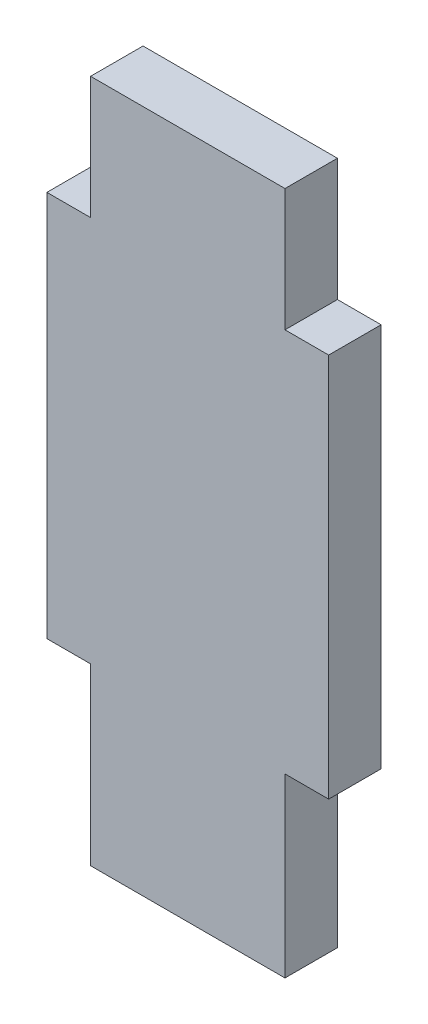
ISO-10303-21;
HEADER;
FILE_DESCRIPTION(('STEP AP214'),'2;1');
FILE_NAME('part.step','',(''),(''),'','','');
FILE_SCHEMA(('AUTOMOTIVE_DESIGN { 1 0 10303 214 1 1 1 1 }'));
ENDSEC;
DATA;
#1=APPLICATION_CONTEXT('core data for automotive mechanical design processes');
#2=APPLICATION_PROTOCOL_DEFINITION('international standard','automotive_design',2000,#1);
#3=PRODUCT_CONTEXT('',#1,'mechanical');
#4=PRODUCT('Part','Part','',(#3));
#5=PRODUCT_RELATED_PRODUCT_CATEGORY('part','',(#4));
#6=PRODUCT_DEFINITION_FORMATION('','',#4);
#7=PRODUCT_DEFINITION_CONTEXT('part definition',#1,'design');
#8=PRODUCT_DEFINITION('design','',#6,#7);
#9=PRODUCT_DEFINITION_SHAPE('','',#8);
#10=(LENGTH_UNIT() NAMED_UNIT(*) SI_UNIT(.MILLI.,.METRE.));
#11=(NAMED_UNIT(*) PLANE_ANGLE_UNIT() SI_UNIT($,.RADIAN.));
#12=(NAMED_UNIT(*) SI_UNIT($,.STERADIAN.) SOLID_ANGLE_UNIT());
#13=UNCERTAINTY_MEASURE_WITH_UNIT(LENGTH_MEASURE(1.E-05),#10,'distance_accuracy_value','');
#14=(GEOMETRIC_REPRESENTATION_CONTEXT(3) GLOBAL_UNCERTAINTY_ASSIGNED_CONTEXT((#13)) GLOBAL_UNIT_ASSIGNED_CONTEXT((#10,
#11,#12)) REPRESENTATION_CONTEXT('',''));
#15=CARTESIAN_POINT('',(0.,0.,0.));
#16=DIRECTION('',(0.,0.,1.));
#17=DIRECTION('',(1.,0.,0.));
#18=AXIS2_PLACEMENT_3D('',#15,#16,#17);
#19=CARTESIAN_POINT('',(701.892545338705,-103.808025338847,3.));
#20=DIRECTION('',(1.,0.,0.));
#21=DIRECTION('',(0.,0.,-1.));
#22=AXIS2_PLACEMENT_3D('',#19,#20,#21);
#23=PLANE('',#22);
#24=DIRECTION('',(0.,-1.,0.));
#25=VECTOR('',#24,1.);
#26=CARTESIAN_POINT('',(701.892545338705,-103.808025338847,0.));
#27=LINE('',#26,#25);
#28=CARTESIAN_POINT('',(701.892545338705,-81.6978872067932,0.));
#29=VERTEX_POINT('',#28);
#30=CARTESIAN_POINT('',(701.892545338705,-103.808025338847,0.));
#31=VERTEX_POINT('',#30);
#32=EDGE_CURVE('E124',#29,#31,#27,.T.);
#33=ORIENTED_EDGE('',*,*,#32,.T.);
#34=DIRECTION('',(0.,0.,-1.));
#35=VECTOR('',#34,1.);
#36=CARTESIAN_POINT('',(701.892545338705,-103.808025338847,3.));
#37=LINE('',#36,#35);
#38=CARTESIAN_POINT('',(701.892545338705,-103.808025338847,3.));
#39=VERTEX_POINT('',#38);
#40=EDGE_CURVE('E11',#39,#31,#37,.T.);
#41=ORIENTED_EDGE('',*,*,#40,.F.);
#42=DIRECTION('',(0.,-1.,0.));
#43=VECTOR('',#42,1.);
#44=CARTESIAN_POINT('',(701.892545338705,-103.808025338847,3.));
#45=LINE('',#44,#43);
#46=CARTESIAN_POINT('',(701.892545338705,-81.6978872067932,3.));
#47=VERTEX_POINT('',#46);
#48=EDGE_CURVE('E159',#47,#39,#45,.T.);
#49=ORIENTED_EDGE('',*,*,#48,.F.);
#50=DIRECTION('',(0.,0.,-1.));
#51=VECTOR('',#50,1.);
#52=CARTESIAN_POINT('',(701.892545338705,-81.6978872067932,3.));
#53=LINE('',#52,#51);
#54=EDGE_CURVE('E137',#47,#29,#53,.T.);
#55=ORIENTED_EDGE('',*,*,#54,.T.);
#56=EDGE_LOOP('',(#33,#41,#49,#55));
#57=FACE_BOUND('',#56,.T.);
#58=ADVANCED_FACE('F32',(#57),#23,.F.);
#59=CARTESIAN_POINT('',(704.392545338705,-103.808025338847,3.));
#60=DIRECTION('',(0.,1.,0.));
#61=DIRECTION('',(0.,0.,1.));
#62=AXIS2_PLACEMENT_3D('',#59,#60,#61);
#63=PLANE('',#62);
#64=DIRECTION('',(1.,0.,0.));
#65=VECTOR('',#64,1.);
#66=CARTESIAN_POINT('',(704.392545338705,-103.808025338847,0.));
#67=LINE('',#66,#65);
#68=CARTESIAN_POINT('',(704.392545338705,-103.808025338847,0.));
#69=VERTEX_POINT('',#68);
#70=EDGE_CURVE('E120',#31,#69,#67,.T.);
#71=ORIENTED_EDGE('',*,*,#70,.T.);
#72=DIRECTION('',(0.,0.,-1.));
#73=VECTOR('',#72,1.);
#74=CARTESIAN_POINT('',(704.392545338705,-103.808025338847,3.));
#75=LINE('',#74,#73);
#76=CARTESIAN_POINT('',(704.392545338705,-103.808025338847,3.));
#77=VERTEX_POINT('',#76);
#78=EDGE_CURVE('E39',#77,#69,#75,.T.);
#79=ORIENTED_EDGE('',*,*,#78,.F.);
#80=DIRECTION('',(1.,0.,0.));
#81=VECTOR('',#80,1.);
#82=CARTESIAN_POINT('',(704.392545338705,-103.808025338847,3.));
#83=LINE('',#82,#81);
#84=EDGE_CURVE('E133',#39,#77,#83,.T.);
#85=ORIENTED_EDGE('',*,*,#84,.F.);
#86=ORIENTED_EDGE('',*,*,#40,.T.);
#87=EDGE_LOOP('',(#71,#79,#85,#86));
#88=FACE_BOUND('',#87,.T.);
#89=ADVANCED_FACE('F132',(#88),#63,.F.);
#90=CARTESIAN_POINT('',(704.392545338705,-113.808025338847,3.));
#91=DIRECTION('',(1.,0.,0.));
#92=DIRECTION('',(0.,0.,-1.));
#93=AXIS2_PLACEMENT_3D('',#90,#91,#92);
#94=PLANE('',#93);
#95=DIRECTION('',(0.,-1.,0.));
#96=VECTOR('',#95,1.);
#97=CARTESIAN_POINT('',(704.392545338705,-113.808025338847,0.));
#98=LINE('',#97,#96);
#99=CARTESIAN_POINT('',(704.392545338705,-113.808025338847,0.));
#100=VERTEX_POINT('',#99);
#101=EDGE_CURVE('E126',#69,#100,#98,.T.);
#102=ORIENTED_EDGE('',*,*,#101,.T.);
#103=DIRECTION('',(0.,0.,-1.));
#104=VECTOR('',#103,1.);
#105=CARTESIAN_POINT('',(704.392545338705,-113.808025338847,3.));
#106=LINE('',#105,#104);
#107=CARTESIAN_POINT('',(704.392545338705,-113.808025338847,3.));
#108=VERTEX_POINT('',#107);
#109=EDGE_CURVE('E205',#108,#100,#106,.T.);
#110=ORIENTED_EDGE('',*,*,#109,.F.);
#111=DIRECTION('',(0.,-1.,0.));
#112=VECTOR('',#111,1.);
#113=CARTESIAN_POINT('',(704.392545338705,-113.808025338847,3.));
#114=LINE('',#113,#112);
#115=EDGE_CURVE('E162',#77,#108,#114,.T.);
#116=ORIENTED_EDGE('',*,*,#115,.F.);
#117=ORIENTED_EDGE('',*,*,#78,.T.);
#118=EDGE_LOOP('',(#102,#110,#116,#117));
#119=FACE_BOUND('',#118,.T.);
#120=ADVANCED_FACE('F209',(#119),#94,.F.);
#121=CARTESIAN_POINT('',(715.512545338705,-113.808025338847,3.));
#122=DIRECTION('',(0.,1.,0.));
#123=DIRECTION('',(0.,0.,1.));
#124=AXIS2_PLACEMENT_3D('',#121,#122,#123);
#125=PLANE('',#124);
#126=DIRECTION('',(1.,0.,0.));
#127=VECTOR('',#126,1.);
#128=CARTESIAN_POINT('',(715.512545338705,-113.808025338847,0.));
#129=LINE('',#128,#127);
#130=CARTESIAN_POINT('',(715.512545338705,-113.808025338847,0.));
#131=VERTEX_POINT('',#130);
#132=EDGE_CURVE('E141',#100,#131,#129,.T.);
#133=ORIENTED_EDGE('',*,*,#132,.T.);
#134=DIRECTION('',(0.,0.,-1.));
#135=VECTOR('',#134,1.);
#136=CARTESIAN_POINT('',(715.512545338705,-113.808025338847,3.));
#137=LINE('',#136,#135);
#138=CARTESIAN_POINT('',(715.512545338705,-113.808025338847,3.));
#139=VERTEX_POINT('',#138);
#140=EDGE_CURVE('E202',#139,#131,#137,.T.);
#141=ORIENTED_EDGE('',*,*,#140,.F.);
#142=DIRECTION('',(1.,0.,0.));
#143=VECTOR('',#142,1.);
#144=CARTESIAN_POINT('',(715.512545338705,-113.808025338847,3.));
#145=LINE('',#144,#143);
#146=EDGE_CURVE('E164',#108,#139,#145,.T.);
#147=ORIENTED_EDGE('',*,*,#146,.F.);
#148=ORIENTED_EDGE('',*,*,#109,.T.);
#149=EDGE_LOOP('',(#133,#141,#147,#148));
#150=FACE_BOUND('',#149,.T.);
#151=ADVANCED_FACE('F217',(#150),#125,.F.);
#152=CARTESIAN_POINT('',(715.512545338705,-113.808025338847,3.));
#153=DIRECTION('',(-1.,0.,0.));
#154=DIRECTION('',(0.,0.,1.));
#155=AXIS2_PLACEMENT_3D('',#152,#153,#154);
#156=PLANE('',#155);
#157=DIRECTION('',(0.,1.,0.));
#158=VECTOR('',#157,1.);
#159=CARTESIAN_POINT('',(715.512545338705,-113.808025338847,0.));
#160=LINE('',#159,#158);
#161=CARTESIAN_POINT('',(715.512545338705,-103.697887206793,0.));
#162=VERTEX_POINT('',#161);
#163=EDGE_CURVE('E143',#131,#162,#160,.T.);
#164=ORIENTED_EDGE('',*,*,#163,.T.);
#165=DIRECTION('',(0.,0.,-1.));
#166=VECTOR('',#165,1.);
#167=CARTESIAN_POINT('',(715.512545338705,-103.697887206793,3.));
#168=LINE('',#167,#166);
#169=CARTESIAN_POINT('',(715.512545338705,-103.697887206793,3.));
#170=VERTEX_POINT('',#169);
#171=EDGE_CURVE('E199',#170,#162,#168,.T.);
#172=ORIENTED_EDGE('',*,*,#171,.F.);
#173=DIRECTION('',(0.,1.,0.));
#174=VECTOR('',#173,1.);
#175=CARTESIAN_POINT('',(715.512545338705,-113.808025338847,3.));
#176=LINE('',#175,#174);
#177=EDGE_CURVE('E166',#139,#170,#176,.T.);
#178=ORIENTED_EDGE('',*,*,#177,.F.);
#179=ORIENTED_EDGE('',*,*,#140,.T.);
#180=EDGE_LOOP('',(#164,#172,#178,#179));
#181=FACE_BOUND('',#180,.T.);
#182=ADVANCED_FACE('F220',(#181),#156,.F.);
#183=CARTESIAN_POINT('',(715.512545338705,-103.697887206793,3.));
#184=DIRECTION('',(0.,1.,0.));
#185=DIRECTION('',(0.,0.,1.));
#186=AXIS2_PLACEMENT_3D('',#183,#184,#185);
#187=PLANE('',#186);
#188=DIRECTION('',(1.,0.,0.));
#189=VECTOR('',#188,1.);
#190=CARTESIAN_POINT('',(715.512545338705,-103.697887206793,0.));
#191=LINE('',#190,#189);
#192=CARTESIAN_POINT('',(718.011485221152,-103.697887206793,0.));
#193=VERTEX_POINT('',#192);
#194=EDGE_CURVE('E145',#162,#193,#191,.T.);
#195=ORIENTED_EDGE('',*,*,#194,.T.);
#196=DIRECTION('',(0.,0.,-1.));
#197=VECTOR('',#196,1.);
#198=CARTESIAN_POINT('',(718.011485221152,-103.697887206793,3.));
#199=LINE('',#198,#197);
#200=CARTESIAN_POINT('',(718.011485221152,-103.697887206793,3.));
#201=VERTEX_POINT('',#200);
#202=EDGE_CURVE('E196',#201,#193,#199,.T.);
#203=ORIENTED_EDGE('',*,*,#202,.F.);
#204=DIRECTION('',(1.,0.,0.));
#205=VECTOR('',#204,1.);
#206=CARTESIAN_POINT('',(715.512545338705,-103.697887206793,3.));
#207=LINE('',#206,#205);
#208=EDGE_CURVE('E168',#170,#201,#207,.T.);
#209=ORIENTED_EDGE('',*,*,#208,.F.);
#210=ORIENTED_EDGE('',*,*,#171,.T.);
#211=EDGE_LOOP('',(#195,#203,#209,#210));
#212=FACE_BOUND('',#211,.T.);
#213=ADVANCED_FACE('F225',(#212),#187,.F.);
#214=CARTESIAN_POINT('',(718.011485221152,-81.6978872067932,3.));
#215=DIRECTION('',(-1.,0.,0.));
#216=DIRECTION('',(0.,0.,1.));
#217=AXIS2_PLACEMENT_3D('',#214,#215,#216);
#218=PLANE('',#217);
#219=DIRECTION('',(0.,1.,0.));
#220=VECTOR('',#219,1.);
#221=CARTESIAN_POINT('',(718.011485221152,-81.6978872067932,0.));
#222=LINE('',#221,#220);
#223=CARTESIAN_POINT('',(718.011485221152,-81.6978872067932,0.));
#224=VERTEX_POINT('',#223);
#225=EDGE_CURVE('E147',#193,#224,#222,.T.);
#226=ORIENTED_EDGE('',*,*,#225,.T.);
#227=DIRECTION('',(0.,0.,-1.));
#228=VECTOR('',#227,1.);
#229=CARTESIAN_POINT('',(718.011485221152,-81.6978872067932,3.));
#230=LINE('',#229,#228);
#231=CARTESIAN_POINT('',(718.011485221152,-81.6978872067932,3.));
#232=VERTEX_POINT('',#231);
#233=EDGE_CURVE('E193',#232,#224,#230,.T.);
#234=ORIENTED_EDGE('',*,*,#233,.F.);
#235=DIRECTION('',(0.,1.,0.));
#236=VECTOR('',#235,1.);
#237=CARTESIAN_POINT('',(718.011485221152,-81.6978872067932,3.));
#238=LINE('',#237,#236);
#239=EDGE_CURVE('E170',#201,#232,#238,.T.);
#240=ORIENTED_EDGE('',*,*,#239,.F.);
#241=ORIENTED_EDGE('',*,*,#202,.T.);
#242=EDGE_LOOP('',(#226,#234,#240,#241));
#243=FACE_BOUND('',#242,.T.);
#244=ADVANCED_FACE('F231',(#243),#218,.F.);
#245=CARTESIAN_POINT('',(715.512545338705,-81.6978872067932,3.));
#246=DIRECTION('',(0.,-1.,0.));
#247=DIRECTION('',(0.,0.,-1.));
#248=AXIS2_PLACEMENT_3D('',#245,#246,#247);
#249=PLANE('',#248);
#250=DIRECTION('',(-1.,0.,0.));
#251=VECTOR('',#250,1.);
#252=CARTESIAN_POINT('',(715.512545338705,-81.6978872067932,0.));
#253=LINE('',#252,#251);
#254=CARTESIAN_POINT('',(715.512545338705,-81.6978872067932,0.));
#255=VERTEX_POINT('',#254);
#256=EDGE_CURVE('E149',#224,#255,#253,.T.);
#257=ORIENTED_EDGE('',*,*,#256,.T.);
#258=DIRECTION('',(0.,0.,-1.));
#259=VECTOR('',#258,1.);
#260=CARTESIAN_POINT('',(715.512545338705,-81.6978872067932,3.));
#261=LINE('',#260,#259);
#262=CARTESIAN_POINT('',(715.512545338705,-81.6978872067932,3.));
#263=VERTEX_POINT('',#262);
#264=EDGE_CURVE('E190',#263,#255,#261,.T.);
#265=ORIENTED_EDGE('',*,*,#264,.F.);
#266=DIRECTION('',(-1.,0.,0.));
#267=VECTOR('',#266,1.);
#268=CARTESIAN_POINT('',(715.512545338705,-81.6978872067932,3.));
#269=LINE('',#268,#267);
#270=EDGE_CURVE('E172',#232,#263,#269,.T.);
#271=ORIENTED_EDGE('',*,*,#270,.F.);
#272=ORIENTED_EDGE('',*,*,#233,.T.);
#273=EDGE_LOOP('',(#257,#265,#271,#272));
#274=FACE_BOUND('',#273,.T.);
#275=ADVANCED_FACE('F235',(#274),#249,.F.);
#276=CARTESIAN_POINT('',(715.512545338705,-74.6978872067932,3.));
#277=DIRECTION('',(-1.,0.,0.));
#278=DIRECTION('',(0.,0.,1.));
#279=AXIS2_PLACEMENT_3D('',#276,#277,#278);
#280=PLANE('',#279);
#281=DIRECTION('',(0.,1.,0.));
#282=VECTOR('',#281,1.);
#283=CARTESIAN_POINT('',(715.512545338705,-74.6978872067932,0.));
#284=LINE('',#283,#282);
#285=CARTESIAN_POINT('',(715.512545338705,-74.6978872067932,0.));
#286=VERTEX_POINT('',#285);
#287=EDGE_CURVE('E151',#255,#286,#284,.T.);
#288=ORIENTED_EDGE('',*,*,#287,.T.);
#289=DIRECTION('',(0.,0.,-1.));
#290=VECTOR('',#289,1.);
#291=CARTESIAN_POINT('',(715.512545338705,-74.6978872067932,3.));
#292=LINE('',#291,#290);
#293=CARTESIAN_POINT('',(715.512545338705,-74.6978872067932,3.));
#294=VERTEX_POINT('',#293);
#295=EDGE_CURVE('E187',#294,#286,#292,.T.);
#296=ORIENTED_EDGE('',*,*,#295,.F.);
#297=DIRECTION('',(0.,1.,0.));
#298=VECTOR('',#297,1.);
#299=CARTESIAN_POINT('',(715.512545338705,-74.6978872067932,3.));
#300=LINE('',#299,#298);
#301=EDGE_CURVE('E174',#263,#294,#300,.T.);
#302=ORIENTED_EDGE('',*,*,#301,.F.);
#303=ORIENTED_EDGE('',*,*,#264,.T.);
#304=EDGE_LOOP('',(#288,#296,#302,#303));
#305=FACE_BOUND('',#304,.T.);
#306=ADVANCED_FACE('F240',(#305),#280,.F.);
#307=CARTESIAN_POINT('',(704.392545338705,-74.6978872067932,3.));
#308=DIRECTION('',(0.,-1.,0.));
#309=DIRECTION('',(0.,0.,-1.));
#310=AXIS2_PLACEMENT_3D('',#307,#308,#309);
#311=PLANE('',#310);
#312=DIRECTION('',(-1.,0.,0.));
#313=VECTOR('',#312,1.);
#314=CARTESIAN_POINT('',(704.392545338705,-74.6978872067932,0.));
#315=LINE('',#314,#313);
#316=CARTESIAN_POINT('',(704.392545338705,-74.6978872067932,0.));
#317=VERTEX_POINT('',#316);
#318=EDGE_CURVE('E153',#286,#317,#315,.T.);
#319=ORIENTED_EDGE('',*,*,#318,.T.);
#320=DIRECTION('',(0.,0.,-1.));
#321=VECTOR('',#320,1.);
#322=CARTESIAN_POINT('',(704.392545338705,-74.6978872067932,3.));
#323=LINE('',#322,#321);
#324=CARTESIAN_POINT('',(704.392545338705,-74.6978872067932,3.));
#325=VERTEX_POINT('',#324);
#326=EDGE_CURVE('E184',#325,#317,#323,.T.);
#327=ORIENTED_EDGE('',*,*,#326,.F.);
#328=DIRECTION('',(-1.,0.,0.));
#329=VECTOR('',#328,1.);
#330=CARTESIAN_POINT('',(704.392545338705,-74.6978872067932,3.));
#331=LINE('',#330,#329);
#332=EDGE_CURVE('E176',#294,#325,#331,.T.);
#333=ORIENTED_EDGE('',*,*,#332,.F.);
#334=ORIENTED_EDGE('',*,*,#295,.T.);
#335=EDGE_LOOP('',(#319,#327,#333,#334));
#336=FACE_BOUND('',#335,.T.);
#337=ADVANCED_FACE('F244',(#336),#311,.F.);
#338=CARTESIAN_POINT('',(704.392545338705,-81.6978872067932,3.));
#339=DIRECTION('',(1.,0.,0.));
#340=DIRECTION('',(0.,0.,-1.));
#341=AXIS2_PLACEMENT_3D('',#338,#339,#340);
#342=PLANE('',#341);
#343=DIRECTION('',(0.,-1.,0.));
#344=VECTOR('',#343,1.);
#345=CARTESIAN_POINT('',(704.392545338705,-81.6978872067932,0.));
#346=LINE('',#345,#344);
#347=CARTESIAN_POINT('',(704.392545338705,-81.6978872067932,0.));
#348=VERTEX_POINT('',#347);
#349=EDGE_CURVE('E155',#317,#348,#346,.T.);
#350=ORIENTED_EDGE('',*,*,#349,.T.);
#351=DIRECTION('',(0.,0.,-1.));
#352=VECTOR('',#351,1.);
#353=CARTESIAN_POINT('',(704.392545338705,-81.6978872067932,3.));
#354=LINE('',#353,#352);
#355=CARTESIAN_POINT('',(704.392545338705,-81.6978872067932,3.));
#356=VERTEX_POINT('',#355);
#357=EDGE_CURVE('E181',#356,#348,#354,.T.);
#358=ORIENTED_EDGE('',*,*,#357,.F.);
#359=DIRECTION('',(0.,-1.,0.));
#360=VECTOR('',#359,1.);
#361=CARTESIAN_POINT('',(704.392545338705,-81.6978872067932,3.));
#362=LINE('',#361,#360);
#363=EDGE_CURVE('E51',#325,#356,#362,.T.);
#364=ORIENTED_EDGE('',*,*,#363,.F.);
#365=ORIENTED_EDGE('',*,*,#326,.T.);
#366=EDGE_LOOP('',(#350,#358,#364,#365));
#367=FACE_BOUND('',#366,.T.);
#368=ADVANCED_FACE('F248',(#367),#342,.F.);
#369=CARTESIAN_POINT('',(701.892545338705,-81.6978872067932,3.));
#370=DIRECTION('',(0.,-1.,0.));
#371=DIRECTION('',(0.,0.,-1.));
#372=AXIS2_PLACEMENT_3D('',#369,#370,#371);
#373=PLANE('',#372);
#374=DIRECTION('',(-1.,0.,0.));
#375=VECTOR('',#374,1.);
#376=CARTESIAN_POINT('',(701.892545338705,-81.6978872067932,0.));
#377=LINE('',#376,#375);
#378=EDGE_CURVE('E157',#348,#29,#377,.T.);
#379=ORIENTED_EDGE('',*,*,#378,.T.);
#380=ORIENTED_EDGE('',*,*,#54,.F.);
#381=DIRECTION('',(-1.,0.,0.));
#382=VECTOR('',#381,1.);
#383=CARTESIAN_POINT('',(701.892545338705,-81.6978872067932,3.));
#384=LINE('',#383,#382);
#385=EDGE_CURVE('E46',#356,#47,#384,.T.);
#386=ORIENTED_EDGE('',*,*,#385,.F.);
#387=ORIENTED_EDGE('',*,*,#357,.T.);
#388=EDGE_LOOP('',(#379,#380,#386,#387));
#389=FACE_BOUND('',#388,.T.);
#390=ADVANCED_FACE('F250',(#389),#373,.F.);
#391=CARTESIAN_POINT('',(701.892545338705,-81.6978872067932,3.));
#392=DIRECTION('',(0.,0.,-1.));
#393=DIRECTION('',(-1.,0.,0.));
#394=AXIS2_PLACEMENT_3D('',#391,#392,#393);
#395=PLANE('',#394);
#396=ORIENTED_EDGE('',*,*,#48,.T.);
#397=ORIENTED_EDGE('',*,*,#84,.T.);
#398=ORIENTED_EDGE('',*,*,#115,.T.);
#399=ORIENTED_EDGE('',*,*,#146,.T.);
#400=ORIENTED_EDGE('',*,*,#177,.T.);
#401=ORIENTED_EDGE('',*,*,#208,.T.);
#402=ORIENTED_EDGE('',*,*,#239,.T.);
#403=ORIENTED_EDGE('',*,*,#270,.T.);
#404=ORIENTED_EDGE('',*,*,#301,.T.);
#405=ORIENTED_EDGE('',*,*,#332,.T.);
#406=ORIENTED_EDGE('',*,*,#363,.T.);
#407=ORIENTED_EDGE('',*,*,#385,.T.);
#408=EDGE_LOOP('',(#396,#397,#398,#399,#400,#401,#402,#403,#404,#405,#406,#407));
#409=FACE_BOUND('',#408,.T.);
#410=ADVANCED_FACE('F212',(#409),#395,.F.);
#411=CARTESIAN_POINT('',(701.892545338705,-81.6978872067932,0.));
#412=DIRECTION('',(0.,0.,-1.));
#413=DIRECTION('',(-1.,0.,0.));
#414=AXIS2_PLACEMENT_3D('',#411,#412,#413);
#415=PLANE('',#414);
#416=ORIENTED_EDGE('',*,*,#32,.F.);
#417=ORIENTED_EDGE('',*,*,#378,.F.);
#418=ORIENTED_EDGE('',*,*,#349,.F.);
#419=ORIENTED_EDGE('',*,*,#318,.F.);
#420=ORIENTED_EDGE('',*,*,#287,.F.);
#421=ORIENTED_EDGE('',*,*,#256,.F.);
#422=ORIENTED_EDGE('',*,*,#225,.F.);
#423=ORIENTED_EDGE('',*,*,#194,.F.);
#424=ORIENTED_EDGE('',*,*,#163,.F.);
#425=ORIENTED_EDGE('',*,*,#132,.F.);
#426=ORIENTED_EDGE('',*,*,#101,.F.);
#427=ORIENTED_EDGE('',*,*,#70,.F.);
#428=EDGE_LOOP('',(#416,#417,#418,#419,#420,#421,#422,#423,#424,#425,#426,#427));
#429=FACE_BOUND('',#428,.T.);
#430=ADVANCED_FACE('F121',(#429),#415,.T.);
#431=CLOSED_SHELL('',(#58,#89,#120,#151,#182,#213,#244,#275,#306,#337,#368,#390,#410,#430));
#432=MANIFOLD_SOLID_BREP('B2',#431);
#433=ADVANCED_BREP_SHAPE_REPRESENTATION('',(#18,#432),#14);
#434=SHAPE_DEFINITION_REPRESENTATION(#9,#433);
ENDSEC;
END-ISO-10303-21;
